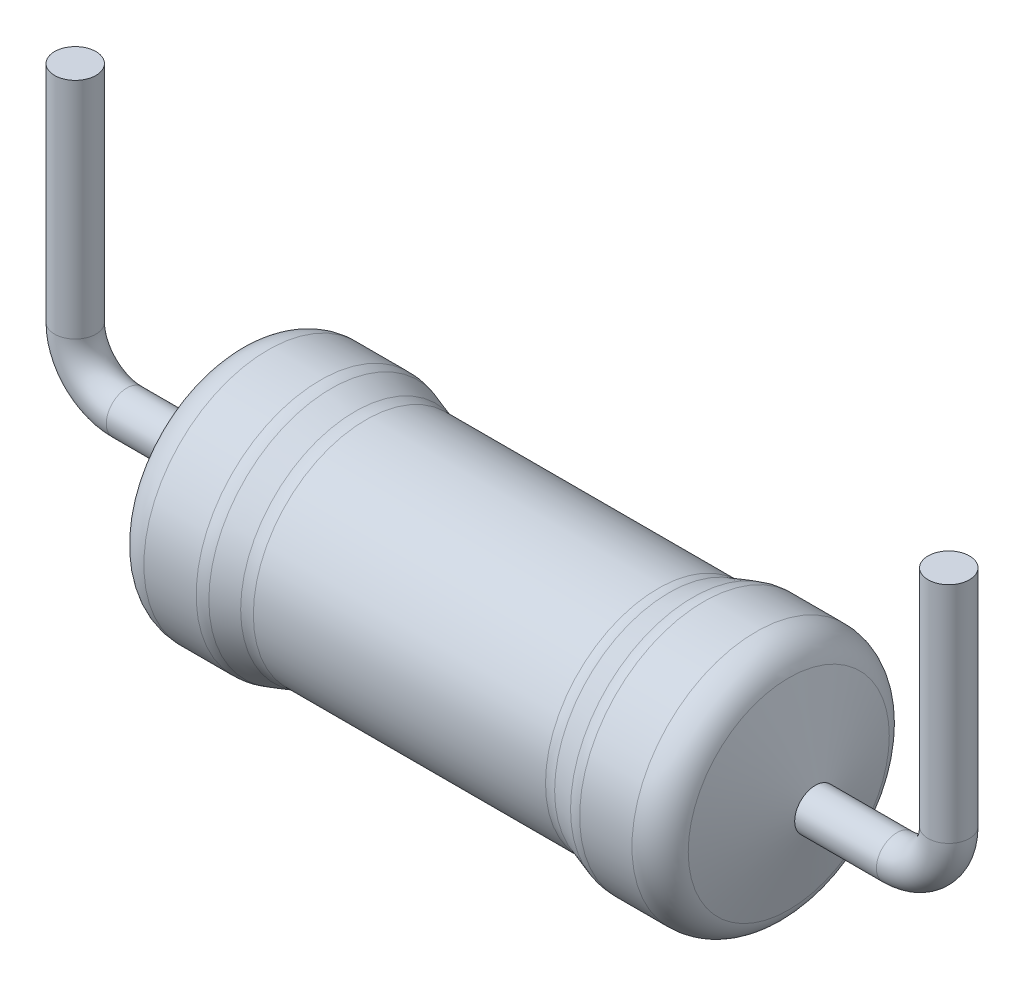
ISO-10303-21;
HEADER;
FILE_DESCRIPTION(('STEP AP214'),'2;1');
FILE_NAME('part.step','',(''),(''),'','','');
FILE_SCHEMA(('AUTOMOTIVE_DESIGN { 1 0 10303 214 1 1 1 1 }'));
ENDSEC;
DATA;
#1=APPLICATION_CONTEXT('core data for automotive mechanical design processes');
#2=APPLICATION_PROTOCOL_DEFINITION('international standard','automotive_design',2000,#1);
#3=PRODUCT_CONTEXT('',#1,'mechanical');
#4=PRODUCT('Part','Part','',(#3));
#5=PRODUCT_RELATED_PRODUCT_CATEGORY('part','',(#4));
#6=PRODUCT_DEFINITION_FORMATION('','',#4);
#7=PRODUCT_DEFINITION_CONTEXT('part definition',#1,'design');
#8=PRODUCT_DEFINITION('design','',#6,#7);
#9=PRODUCT_DEFINITION_SHAPE('','',#8);
#10=(LENGTH_UNIT() NAMED_UNIT(*) SI_UNIT(.MILLI.,.METRE.));
#11=(NAMED_UNIT(*) PLANE_ANGLE_UNIT() SI_UNIT($,.RADIAN.));
#12=(NAMED_UNIT(*) SI_UNIT($,.STERADIAN.) SOLID_ANGLE_UNIT());
#13=UNCERTAINTY_MEASURE_WITH_UNIT(LENGTH_MEASURE(1.E-05),#10,'distance_accuracy_value','');
#14=(GEOMETRIC_REPRESENTATION_CONTEXT(3) GLOBAL_UNCERTAINTY_ASSIGNED_CONTEXT((#13)) GLOBAL_UNIT_ASSIGNED_CONTEXT((#10,
#11,#12)) REPRESENTATION_CONTEXT('',''));
#15=CARTESIAN_POINT('',(0.,0.,0.));
#16=DIRECTION('',(0.,0.,1.));
#17=DIRECTION('',(1.,0.,0.));
#18=AXIS2_PLACEMENT_3D('',#15,#16,#17);
#19=CARTESIAN_POINT('',(4.4,0.,0.));
#20=DIRECTION('',(-1.,0.,0.));
#21=DIRECTION('',(0.,0.,1.));
#22=AXIS2_PLACEMENT_3D('',#19,#20,#21);
#23=CONICAL_SURFACE('',#22,0.3,1.24904577239825);
#24=CARTESIAN_POINT('',(4.01396203899719,0.,0.));
#25=DIRECTION('',(1.,0.,0.));
#26=DIRECTION('',(0.,0.,-1.));
#27=AXIS2_PLACEMENT_3D('',#24,#25,#26);
#28=CIRCLE('',#27,1.45811388300842);
#29=CARTESIAN_POINT('',(4.01396203899719,0.,1.45811388300842));
#30=VERTEX_POINT('',#29);
#31=EDGE_CURVE('E11',#30,#30,#28,.T.);
#32=CARTESIAN_POINT('',(4.4,0.,0.));
#33=DIRECTION('',(-1.,0.,0.));
#34=DIRECTION('',(0.,0.,1.));
#35=AXIS2_PLACEMENT_3D('',#32,#33,#34);
#36=CIRCLE('',#35,0.3);
#37=CARTESIAN_POINT('',(4.4,0.,0.299999999999999));
#38=VERTEX_POINT('',#37);
#39=EDGE_CURVE('E61',#38,#38,#36,.T.);
#40=CARTESIAN_POINT('',(4.01396203899719,0.,1.45811388300842));
#41=CARTESIAN_POINT('',(4.01798326775764,0.,1.44605019672708));
#42=CARTESIAN_POINT('',(4.02200449651808,0.,1.43398651044574));
#43=CARTESIAN_POINT('',(4.03004695403898,0.,1.40985913788307));
#44=CARTESIAN_POINT('',(4.03406818279942,0.,1.39779545160173));
#45=CARTESIAN_POINT('',(4.04211064032032,0.,1.37366807903906));
#46=CARTESIAN_POINT('',(4.04613186908076,0.,1.36160439275772));
#47=CARTESIAN_POINT('',(4.05417432660165,0.,1.33747702019504));
#48=CARTESIAN_POINT('',(4.0581955553621,0.,1.32541333391371));
#49=CARTESIAN_POINT('',(4.06623801288299,0.,1.30128596135103));
#50=CARTESIAN_POINT('',(4.07025924164344,0.,1.28922227506969));
#51=CARTESIAN_POINT('',(4.07830169916433,0.,1.26509490250702));
#52=CARTESIAN_POINT('',(4.08232292792477,0.,1.25303121622568));
#53=CARTESIAN_POINT('',(4.09036538544566,0.,1.228903843663));
#54=CARTESIAN_POINT('',(4.09438661420611,0.,1.21684015738167));
#55=CARTESIAN_POINT('',(4.102429071727,0.,1.19271278481899));
#56=CARTESIAN_POINT('',(4.10645030048745,0.,1.18064909853765));
#57=CARTESIAN_POINT('',(4.11449275800834,0.,1.15652172597498));
#58=CARTESIAN_POINT('',(4.11851398676879,0.,1.14445803969364));
#59=CARTESIAN_POINT('',(4.12655644428968,0.,1.12033066713096));
#60=CARTESIAN_POINT('',(4.13057767305012,0.,1.10826698084963));
#61=CARTESIAN_POINT('',(4.13862013057102,0.,1.08413960828695));
#62=CARTESIAN_POINT('',(4.14264135933146,0.,1.07207592200561));
#63=CARTESIAN_POINT('',(4.15068381685235,0.,1.04794854944294));
#64=CARTESIAN_POINT('',(4.1547050456128,0.,1.0358848631616));
#65=CARTESIAN_POINT('',(4.16274750313369,0.,1.01175749059892));
#66=CARTESIAN_POINT('',(4.16676873189414,0.,0.999693804317587));
#67=CARTESIAN_POINT('',(4.17481118941503,0.,0.975566431754911));
#68=CARTESIAN_POINT('',(4.17883241817547,0.,0.963502745473573));
#69=CARTESIAN_POINT('',(4.18687487569637,0.,0.939375372910898));
#70=CARTESIAN_POINT('',(4.19089610445681,0.,0.92731168662956));
#71=CARTESIAN_POINT('',(4.19893856197771,0.,0.903184314066885));
#72=CARTESIAN_POINT('',(4.20295979073815,0.,0.891120627785547));
#73=CARTESIAN_POINT('',(4.21100224825904,0.,0.866993255222872));
#74=CARTESIAN_POINT('',(4.21502347701949,0.,0.854929568941534));
#75=CARTESIAN_POINT('',(4.22306593454038,0.,0.830802196378858));
#76=CARTESIAN_POINT('',(4.22708716330083,0.,0.818738510097521));
#77=CARTESIAN_POINT('',(4.23512962082172,0.,0.794611137534845));
#78=CARTESIAN_POINT('',(4.23915084958217,0.,0.782547451253508));
#79=CARTESIAN_POINT('',(4.24719330710306,0.,0.758420078690832));
#80=CARTESIAN_POINT('',(4.2512145358635,0.,0.746356392409494));
#81=CARTESIAN_POINT('',(4.25925699338439,0.,0.722229019846819));
#82=CARTESIAN_POINT('',(4.26327822214484,0.,0.710165333565481));
#83=CARTESIAN_POINT('',(4.27132067966573,0.,0.686037961002806));
#84=CARTESIAN_POINT('',(4.27534190842618,0.,0.673974274721468));
#85=CARTESIAN_POINT('',(4.28338436594707,0.,0.649846902158793));
#86=CARTESIAN_POINT('',(4.28740559470751,0.,0.637783215877455));
#87=CARTESIAN_POINT('',(4.29544805222841,0.,0.61365584331478));
#88=CARTESIAN_POINT('',(4.29946928098885,0.,0.601592157033442));
#89=CARTESIAN_POINT('',(4.30751173850974,0.,0.577464784470766));
#90=CARTESIAN_POINT('',(4.31153296727019,0.,0.565401098189429));
#91=CARTESIAN_POINT('',(4.31957542479108,0.,0.541273725626753));
#92=CARTESIAN_POINT('',(4.32359665355153,0.,0.529210039345415));
#93=CARTESIAN_POINT('',(4.33163911107242,0.,0.50508266678274));
#94=CARTESIAN_POINT('',(4.33566033983286,0.,0.493018980501402));
#95=CARTESIAN_POINT('',(4.34370279735376,0.,0.468891607938727));
#96=CARTESIAN_POINT('',(4.3477240261142,0.,0.456827921657389));
#97=CARTESIAN_POINT('',(4.3557664836351,0.,0.432700549094714));
#98=CARTESIAN_POINT('',(4.35978771239554,0.,0.420636862813376));
#99=CARTESIAN_POINT('',(4.36783016991643,0.,0.3965094902507));
#100=CARTESIAN_POINT('',(4.37185139867688,0.,0.384445803969363));
#101=CARTESIAN_POINT('',(4.37989385619777,0.,0.360318431406687));
#102=CARTESIAN_POINT('',(4.38391508495822,0.,0.34825474512535));
#103=CARTESIAN_POINT('',(4.39195754247911,0.,0.324127372562674));
#104=CARTESIAN_POINT('',(4.39597877123955,0.,0.312063686281337));
#105=CARTESIAN_POINT('',(4.4,0.,0.299999999999999));
#106=B_SPLINE_CURVE_WITH_KNOTS('',3,(#40,#41,#42,#43,#44,#45,#46,#47,#48,#49,#50,#51,#52,#53,
#54,#55,#56,#57,#58,#59,#60,#61,#62,#63,#64,#65,#66,#67,#68,#69,#70,#71,#72,#73,#74,#75,#76,#77,
#78,#79,#80,#81,#82,#83,#84,#85,#86,#87,#88,#89,#90,#91,#92,#93,#94,#95,#96,#97,#98,#99,#100,
#101,#102,#103,#104,#105),.UNSPECIFIED.,.F.,.F.,(4,2,2,2,2,2,2,2,2,2,2,2,2,2,2,2,2,2,2,2,2,2,2,
2,2,2,2,2,2,2,2,2,4),(0.,0.0381487256267539,0.0762974512535079,0.114446176880262,
0.152594902507016,0.19074362813377,0.228892353760524,0.267041079387278,0.305189805014032,
0.343338530640786,0.38148725626754,0.419635981894294,0.457784707521048,0.495933433147802,
0.534082158774556,0.57223088440131,0.610379610028064,0.648528335654818,0.686677061281572,
0.724825786908327,0.76297451253508,0.801123238161835,0.839271963788589,0.877420689415343,
0.915569415042097,0.953718140668851,0.991866866295605,1.03001559192236,1.06816431754911,
1.10631304317587,1.14446176880262,1.18261049442937,1.22075922005613),.UNSPECIFIED.);
#107=EDGE_CURVE('BSEAM39',#30,#38,#106,.T.);
#108=ORIENTED_EDGE('',*,*,#31,.T.);
#109=ORIENTED_EDGE('',*,*,#39,.T.);
#110=ORIENTED_EDGE('',*,*,#107,.T.);
#111=ORIENTED_EDGE('',*,*,#107,.F.);
#112=EDGE_LOOP('',(#108,#110,#109,#111));
#113=FACE_BOUND('',#112,.T.);
#114=ADVANCED_FACE('F39',(#113),#23,.T.);
#115=CARTESIAN_POINT('',(0.,0.,0.));
#116=DIRECTION('',(-1.,0.,0.));
#117=DIRECTION('',(0.,0.,1.));
#118=AXIS2_PLACEMENT_3D('',#115,#116,#117);
#119=CYLINDRICAL_SURFACE('',#118,1.8);
#120=CARTESIAN_POINT('',(2.78113883008419,0.,0.));
#121=DIRECTION('',(1.,0.,0.));
#122=DIRECTION('',(0.,0.,-1.));
#123=AXIS2_PLACEMENT_3D('',#120,#121,#122);
#124=CIRCLE('',#123,1.8);
#125=CARTESIAN_POINT('',(2.78113883008419,0.,-1.8));
#126=VERTEX_POINT('',#125);
#127=EDGE_CURVE('E48',#126,#126,#124,.T.);
#128=ORIENTED_EDGE('',*,*,#127,.T.);
#129=EDGE_LOOP('',(#128));
#130=FACE_BOUND('',#129,.T.);
#131=CARTESIAN_POINT('',(3.53962038997194,0.,0.));
#132=DIRECTION('',(1.,0.,0.));
#133=DIRECTION('',(0.,0.,-1.));
#134=AXIS2_PLACEMENT_3D('',#131,#132,#133);
#135=CIRCLE('',#134,1.8);
#136=CARTESIAN_POINT('',(3.53962038997194,0.,-1.8));
#137=VERTEX_POINT('',#136);
#138=EDGE_CURVE('E113',#137,#137,#135,.F.);
#139=ORIENTED_EDGE('',*,*,#138,.T.);
#140=EDGE_LOOP('',(#139));
#141=FACE_BOUND('',#140,.T.);
#142=ADVANCED_FACE('F120',(#130,#141),#119,.T.);
#143=CARTESIAN_POINT('',(2.7,0.,0.));
#144=DIRECTION('',(1.,0.,0.));
#145=DIRECTION('',(0.,0.,-1.));
#146=AXIS2_PLACEMENT_3D('',#143,#144,#145);
#147=CONICAL_SURFACE('',#146,1.8,0.321750554396642);
#148=CARTESIAN_POINT('',(2.27697505292423,0.,0.));
#149=DIRECTION('',(1.,0.,0.));
#150=DIRECTION('',(0.,0.,-1.));
#151=AXIS2_PLACEMENT_3D('',#148,#149,#150);
#152=CIRCLE('',#151,1.65899168430808);
#153=CARTESIAN_POINT('',(2.27697505292423,0.,-1.65899168430808));
#154=VERTEX_POINT('',#153);
#155=EDGE_CURVE('E109',#154,#154,#152,.T.);
#156=ORIENTED_EDGE('',*,*,#155,.T.);
#157=EDGE_LOOP('',(#156));
#158=FACE_BOUND('',#157,.T.);
#159=CARTESIAN_POINT('',(2.62302494707577,0.,0.));
#160=DIRECTION('',(-1.,0.,0.));
#161=DIRECTION('',(0.,0.,1.));
#162=AXIS2_PLACEMENT_3D('',#159,#160,#161);
#163=CIRCLE('',#162,1.77434164902526);
#164=CARTESIAN_POINT('',(2.62302494707577,0.,1.77434164902526));
#165=VERTEX_POINT('',#164);
#166=EDGE_CURVE('E105',#165,#165,#163,.T.);
#167=ORIENTED_EDGE('',*,*,#166,.T.);
#168=EDGE_LOOP('',(#167));
#169=FACE_BOUND('',#168,.T.);
#170=ADVANCED_FACE('F129',(#158,#169),#147,.T.);
#171=CARTESIAN_POINT('',(0.,0.,0.));
#172=DIRECTION('',(-1.,0.,0.));
#173=DIRECTION('',(0.,0.,1.));
#174=AXIS2_PLACEMENT_3D('',#171,#172,#173);
#175=CYLINDRICAL_SURFACE('',#174,1.63333333333333);
#176=CARTESIAN_POINT('',(-2.11886116991581,0.,0.));
#177=DIRECTION('',(-1.,0.,0.));
#178=DIRECTION('',(0.,0.,1.));
#179=AXIS2_PLACEMENT_3D('',#176,#177,#178);
#180=CIRCLE('',#179,1.63333333333333);
#181=CARTESIAN_POINT('',(-2.11886116991581,0.,1.63333333333333));
#182=VERTEX_POINT('',#181);
#183=EDGE_CURVE('E101',#182,#182,#180,.F.);
#184=ORIENTED_EDGE('',*,*,#183,.T.);
#185=EDGE_LOOP('',(#184));
#186=FACE_BOUND('',#185,.T.);
#187=CARTESIAN_POINT('',(2.11886116991581,0.,0.));
#188=DIRECTION('',(-1.,0.,0.));
#189=DIRECTION('',(0.,0.,1.));
#190=AXIS2_PLACEMENT_3D('',#187,#188,#189);
#191=CIRCLE('',#190,1.63333333333333);
#192=CARTESIAN_POINT('',(2.11886116991581,0.,1.63333333333333));
#193=VERTEX_POINT('',#192);
#194=EDGE_CURVE('E97',#193,#193,#191,.T.);
#195=ORIENTED_EDGE('',*,*,#194,.T.);
#196=EDGE_LOOP('',(#195));
#197=FACE_BOUND('',#196,.T.);
#198=ADVANCED_FACE('F131',(#186,#197),#175,.T.);
#199=CARTESIAN_POINT('',(-2.2,0.,0.));
#200=DIRECTION('',(-1.,0.,0.));
#201=DIRECTION('',(0.,0.,1.));
#202=AXIS2_PLACEMENT_3D('',#199,#200,#201);
#203=CONICAL_SURFACE('',#202,1.63333333333333,0.321750554396643);
#204=CARTESIAN_POINT('',(-2.62302494707577,0.,0.));
#205=DIRECTION('',(1.,0.,0.));
#206=DIRECTION('',(0.,0.,-1.));
#207=AXIS2_PLACEMENT_3D('',#204,#205,#206);
#208=CIRCLE('',#207,1.77434164902526);
#209=CARTESIAN_POINT('',(-2.62302494707577,0.,-1.77434164902526));
#210=VERTEX_POINT('',#209);
#211=EDGE_CURVE('E93',#210,#210,#208,.T.);
#212=ORIENTED_EDGE('',*,*,#211,.T.);
#213=EDGE_LOOP('',(#212));
#214=FACE_BOUND('',#213,.T.);
#215=CARTESIAN_POINT('',(-2.27697505292423,0.,0.));
#216=DIRECTION('',(-1.,0.,0.));
#217=DIRECTION('',(0.,0.,1.));
#218=AXIS2_PLACEMENT_3D('',#215,#216,#217);
#219=CIRCLE('',#218,1.65899168430808);
#220=CARTESIAN_POINT('',(-2.27697505292423,0.,1.65899168430808));
#221=VERTEX_POINT('',#220);
#222=EDGE_CURVE('E89',#221,#221,#219,.T.);
#223=ORIENTED_EDGE('',*,*,#222,.T.);
#224=EDGE_LOOP('',(#223));
#225=FACE_BOUND('',#224,.T.);
#226=ADVANCED_FACE('F138',(#214,#225),#203,.T.);
#227=CARTESIAN_POINT('',(0.,0.,0.));
#228=DIRECTION('',(-1.,0.,0.));
#229=DIRECTION('',(0.,0.,1.));
#230=AXIS2_PLACEMENT_3D('',#227,#228,#229);
#231=CYLINDRICAL_SURFACE('',#230,1.8);
#232=CARTESIAN_POINT('',(-3.53962038997194,0.,0.));
#233=DIRECTION('',(1.,0.,0.));
#234=DIRECTION('',(0.,0.,-1.));
#235=AXIS2_PLACEMENT_3D('',#232,#233,#234);
#236=CIRCLE('',#235,1.8);
#237=CARTESIAN_POINT('',(-3.53962038997194,0.,-1.8));
#238=VERTEX_POINT('',#237);
#239=EDGE_CURVE('E85',#238,#238,#236,.T.);
#240=ORIENTED_EDGE('',*,*,#239,.T.);
#241=EDGE_LOOP('',(#240));
#242=FACE_BOUND('',#241,.T.);
#243=CARTESIAN_POINT('',(-2.78113883008419,0.,0.));
#244=DIRECTION('',(1.,0.,0.));
#245=DIRECTION('',(0.,0.,-1.));
#246=AXIS2_PLACEMENT_3D('',#243,#244,#245);
#247=CIRCLE('',#246,1.8);
#248=CARTESIAN_POINT('',(-2.78113883008419,0.,-1.8));
#249=VERTEX_POINT('',#248);
#250=EDGE_CURVE('E81',#249,#249,#247,.F.);
#251=ORIENTED_EDGE('',*,*,#250,.T.);
#252=EDGE_LOOP('',(#251));
#253=FACE_BOUND('',#252,.T.);
#254=ADVANCED_FACE('F285',(#242,#253),#231,.T.);
#255=CARTESIAN_POINT('',(-3.9,0.,0.));
#256=DIRECTION('',(1.,0.,0.));
#257=DIRECTION('',(0.,0.,-1.));
#258=AXIS2_PLACEMENT_3D('',#255,#256,#257);
#259=CONICAL_SURFACE('',#258,1.8,1.24904577239825);
#260=CARTESIAN_POINT('',(-4.0139620389972,0.,0.));
#261=DIRECTION('',(-1.,0.,0.));
#262=DIRECTION('',(0.,0.,1.));
#263=AXIS2_PLACEMENT_3D('',#260,#261,#262);
#264=CIRCLE('',#263,1.45811388300842);
#265=CARTESIAN_POINT('',(-4.01396203899719,0.,-1.45811388300842));
#266=VERTEX_POINT('',#265);
#267=EDGE_CURVE('E77',#266,#266,#264,.T.);
#268=CARTESIAN_POINT('',(-4.4,0.,0.));
#269=DIRECTION('',(-1.,0.,0.));
#270=DIRECTION('',(0.,0.,1.));
#271=AXIS2_PLACEMENT_3D('',#268,#269,#270);
#272=CIRCLE('',#271,0.3);
#273=CARTESIAN_POINT('',(-4.4,0.,-0.300000000000001));
#274=VERTEX_POINT('',#273);
#275=EDGE_CURVE('E67',#274,#274,#272,.T.);
#276=CARTESIAN_POINT('',(-4.01396203899719,0.,-1.45811388300842));
#277=CARTESIAN_POINT('',(-4.01798326775764,0.,-1.44605019672708));
#278=CARTESIAN_POINT('',(-4.02200449651809,0.,-1.43398651044574));
#279=CARTESIAN_POINT('',(-4.03004695403898,0.,-1.40985913788307));
#280=CARTESIAN_POINT('',(-4.03406818279942,0.,-1.39779545160173));
#281=CARTESIAN_POINT('',(-4.04211064032032,0.,-1.37366807903906));
#282=CARTESIAN_POINT('',(-4.04613186908076,0.,-1.36160439275772));
#283=CARTESIAN_POINT('',(-4.05417432660165,0.,-1.33747702019504));
#284=CARTESIAN_POINT('',(-4.0581955553621,0.,-1.3254133339137));
#285=CARTESIAN_POINT('',(-4.06623801288299,0.,-1.30128596135103));
#286=CARTESIAN_POINT('',(-4.07025924164344,0.,-1.28922227506969));
#287=CARTESIAN_POINT('',(-4.07830169916433,0.,-1.26509490250702));
#288=CARTESIAN_POINT('',(-4.08232292792477,0.,-1.25303121622568));
#289=CARTESIAN_POINT('',(-4.09036538544566,0.,-1.228903843663));
#290=CARTESIAN_POINT('',(-4.09438661420611,0.,-1.21684015738167));
#291=CARTESIAN_POINT('',(-4.102429071727,0.,-1.19271278481899));
#292=CARTESIAN_POINT('',(-4.10645030048745,0.,-1.18064909853765));
#293=CARTESIAN_POINT('',(-4.11449275800834,0.,-1.15652172597498));
#294=CARTESIAN_POINT('',(-4.11851398676879,0.,-1.14445803969364));
#295=CARTESIAN_POINT('',(-4.12655644428968,0.,-1.12033066713096));
#296=CARTESIAN_POINT('',(-4.13057767305013,0.,-1.10826698084963));
#297=CARTESIAN_POINT('',(-4.13862013057102,0.,-1.08413960828695));
#298=CARTESIAN_POINT('',(-4.14264135933146,0.,-1.07207592200561));
#299=CARTESIAN_POINT('',(-4.15068381685235,0.,-1.04794854944294));
#300=CARTESIAN_POINT('',(-4.1547050456128,0.,-1.0358848631616));
#301=CARTESIAN_POINT('',(-4.16274750313369,0.,-1.01175749059892));
#302=CARTESIAN_POINT('',(-4.16676873189414,0.,-0.999693804317587));
#303=CARTESIAN_POINT('',(-4.17481118941503,0.,-0.975566431754912));
#304=CARTESIAN_POINT('',(-4.17883241817548,0.,-0.963502745473574));
#305=CARTESIAN_POINT('',(-4.18687487569637,0.,-0.939375372910899));
#306=CARTESIAN_POINT('',(-4.19089610445681,0.,-0.927311686629561));
#307=CARTESIAN_POINT('',(-4.19893856197771,0.,-0.903184314066886));
#308=CARTESIAN_POINT('',(-4.20295979073815,0.,-0.891120627785548));
#309=CARTESIAN_POINT('',(-4.21100224825904,0.,-0.866993255222873));
#310=CARTESIAN_POINT('',(-4.21502347701949,0.,-0.854929568941535));
#311=CARTESIAN_POINT('',(-4.22306593454038,0.,-0.83080219637886));
#312=CARTESIAN_POINT('',(-4.22708716330083,0.,-0.818738510097522));
#313=CARTESIAN_POINT('',(-4.23512962082172,0.,-0.794611137534846));
#314=CARTESIAN_POINT('',(-4.23915084958216,0.,-0.782547451253509));
#315=CARTESIAN_POINT('',(-4.24719330710306,0.,-0.758420078690833));
#316=CARTESIAN_POINT('',(-4.2512145358635,0.,-0.746356392409496));
#317=CARTESIAN_POINT('',(-4.25925699338439,0.,-0.72222901984682));
#318=CARTESIAN_POINT('',(-4.26327822214484,0.,-0.710165333565483));
#319=CARTESIAN_POINT('',(-4.27132067966573,0.,-0.686037961002807));
#320=CARTESIAN_POINT('',(-4.27534190842618,0.,-0.67397427472147));
#321=CARTESIAN_POINT('',(-4.28338436594707,0.,-0.649846902158794));
#322=CARTESIAN_POINT('',(-4.28740559470751,0.,-0.637783215877457));
#323=CARTESIAN_POINT('',(-4.29544805222841,0.,-0.613655843314781));
#324=CARTESIAN_POINT('',(-4.29946928098885,0.,-0.601592157033444));
#325=CARTESIAN_POINT('',(-4.30751173850974,0.,-0.577464784470768));
#326=CARTESIAN_POINT('',(-4.31153296727019,0.,-0.565401098189431));
#327=CARTESIAN_POINT('',(-4.31957542479108,0.,-0.541273725626755));
#328=CARTESIAN_POINT('',(-4.32359665355153,0.,-0.529210039345417));
#329=CARTESIAN_POINT('',(-4.33163911107242,0.,-0.505082666782742));
#330=CARTESIAN_POINT('',(-4.33566033983287,0.,-0.493018980501404));
#331=CARTESIAN_POINT('',(-4.34370279735376,0.,-0.468891607938729));
#332=CARTESIAN_POINT('',(-4.3477240261142,0.,-0.456827921657391));
#333=CARTESIAN_POINT('',(-4.3557664836351,0.,-0.432700549094716));
#334=CARTESIAN_POINT('',(-4.35978771239554,0.,-0.420636862813378));
#335=CARTESIAN_POINT('',(-4.36783016991643,0.,-0.396509490250703));
#336=CARTESIAN_POINT('',(-4.37185139867688,0.,-0.384445803969365));
#337=CARTESIAN_POINT('',(-4.37989385619777,0.,-0.36031843140669));
#338=CARTESIAN_POINT('',(-4.38391508495822,0.,-0.348254745125352));
#339=CARTESIAN_POINT('',(-4.39195754247911,0.,-0.324127372562677));
#340=CARTESIAN_POINT('',(-4.39597877123955,0.,-0.312063686281339));
#341=CARTESIAN_POINT('',(-4.4,0.,-0.300000000000001));
#342=B_SPLINE_CURVE_WITH_KNOTS('',3,(#276,#277,#278,#279,#280,#281,#282,#283,#284,#285,#286,
#287,#288,#289,#290,#291,#292,#293,#294,#295,#296,#297,#298,#299,#300,#301,#302,#303,#304,#305,
#306,#307,#308,#309,#310,#311,#312,#313,#314,#315,#316,#317,#318,#319,#320,#321,#322,#323,#324,
#325,#326,#327,#328,#329,#330,#331,#332,#333,#334,#335,#336,#337,#338,#339,#340,#341),
.UNSPECIFIED.,.F.,.F.,(4,2,2,2,2,2,2,2,2,2,2,2,2,2,2,2,2,2,2,2,2,2,2,2,2,2,2,2,2,2,2,2,4),(0.,
0.038148725626754,0.076297451253508,0.114446176880262,0.152594902507016,0.19074362813377,
0.228892353760523,0.267041079387277,0.305189805014031,0.343338530640785,0.381487256267539,
0.419635981894293,0.457784707521047,0.495933433147801,0.534082158774555,0.572230884401309,
0.610379610028063,0.648528335654816,0.686677061281571,0.724825786908325,0.762974512535079,
0.801123238161833,0.839271963788586,0.87742068941534,0.915569415042094,0.953718140668848,
0.991866866295602,1.03001559192236,1.06816431754911,1.10631304317586,1.14446176880262,
1.18261049442937,1.22075922005613),.UNSPECIFIED.);
#343=EDGE_CURVE('BSEAM153',#266,#274,#342,.T.);
#344=ORIENTED_EDGE('',*,*,#267,.T.);
#345=ORIENTED_EDGE('',*,*,#275,.F.);
#346=ORIENTED_EDGE('',*,*,#343,.T.);
#347=ORIENTED_EDGE('',*,*,#343,.F.);
#348=EDGE_LOOP('',(#344,#346,#345,#347));
#349=FACE_BOUND('',#348,.T.);
#350=ADVANCED_FACE('F153',(#349),#259,.T.);
#351=CARTESIAN_POINT('',(-3.53962038997194,0.,0.));
#352=DIRECTION('',(1.,0.,0.));
#353=DIRECTION('',(0.,0.,-1.));
#354=AXIS2_PLACEMENT_3D('',#351,#352,#353);
#355=TOROIDAL_SURFACE('',#354,1.3,0.5);
#356=ORIENTED_EDGE('',*,*,#239,.F.);
#357=EDGE_LOOP('',(#356));
#358=FACE_BOUND('',#357,.T.);
#359=ORIENTED_EDGE('',*,*,#267,.F.);
#360=EDGE_LOOP('',(#359));
#361=FACE_BOUND('',#360,.T.);
#362=ADVANCED_FACE('F149',(#358,#361),#355,.T.);
#363=CARTESIAN_POINT('',(-2.78113883008419,0.,0.));
#364=DIRECTION('',(1.,0.,0.));
#365=DIRECTION('',(0.,0.,-1.));
#366=AXIS2_PLACEMENT_3D('',#363,#364,#365);
#367=TOROIDAL_SURFACE('',#366,1.3,0.5);
#368=ORIENTED_EDGE('',*,*,#211,.F.);
#369=EDGE_LOOP('',(#368));
#370=FACE_BOUND('',#369,.T.);
#371=ORIENTED_EDGE('',*,*,#250,.F.);
#372=EDGE_LOOP('',(#371));
#373=FACE_BOUND('',#372,.T.);
#374=ADVANCED_FACE('F152',(#370,#373),#367,.T.);
#375=CARTESIAN_POINT('',(-2.11886116991581,0.,0.));
#376=DIRECTION('',(-1.,0.,0.));
#377=DIRECTION('',(0.,0.,1.));
#378=AXIS2_PLACEMENT_3D('',#375,#376,#377);
#379=TOROIDAL_SURFACE('',#378,2.13333333333333,0.5);
#380=ORIENTED_EDGE('',*,*,#183,.F.);
#381=EDGE_LOOP('',(#380));
#382=FACE_BOUND('',#381,.T.);
#383=ORIENTED_EDGE('',*,*,#222,.F.);
#384=EDGE_LOOP('',(#383));
#385=FACE_BOUND('',#384,.T.);
#386=ADVANCED_FACE('F157',(#382,#385),#379,.F.);
#387=CARTESIAN_POINT('',(2.11886116991581,0.,0.));
#388=DIRECTION('',(-1.,0.,0.));
#389=DIRECTION('',(0.,0.,1.));
#390=AXIS2_PLACEMENT_3D('',#387,#388,#389);
#391=TOROIDAL_SURFACE('',#390,2.13333333333333,0.5);
#392=ORIENTED_EDGE('',*,*,#155,.F.);
#393=EDGE_LOOP('',(#392));
#394=FACE_BOUND('',#393,.T.);
#395=ORIENTED_EDGE('',*,*,#194,.F.);
#396=EDGE_LOOP('',(#395));
#397=FACE_BOUND('',#396,.T.);
#398=ADVANCED_FACE('F126',(#394,#397),#391,.F.);
#399=CARTESIAN_POINT('',(2.78113883008419,0.,0.));
#400=DIRECTION('',(1.,0.,0.));
#401=DIRECTION('',(0.,0.,-1.));
#402=AXIS2_PLACEMENT_3D('',#399,#400,#401);
#403=TOROIDAL_SURFACE('',#402,1.3,0.5);
#404=ORIENTED_EDGE('',*,*,#127,.F.);
#405=EDGE_LOOP('',(#404));
#406=FACE_BOUND('',#405,.T.);
#407=ORIENTED_EDGE('',*,*,#166,.F.);
#408=EDGE_LOOP('',(#407));
#409=FACE_BOUND('',#408,.T.);
#410=ADVANCED_FACE('F123',(#406,#409),#403,.T.);
#411=CARTESIAN_POINT('',(3.53962038997194,0.,0.));
#412=DIRECTION('',(1.,0.,0.));
#413=DIRECTION('',(0.,0.,-1.));
#414=AXIS2_PLACEMENT_3D('',#411,#412,#413);
#415=TOROIDAL_SURFACE('',#414,1.3,0.5);
#416=ORIENTED_EDGE('',*,*,#31,.F.);
#417=EDGE_LOOP('',(#416));
#418=FACE_BOUND('',#417,.T.);
#419=ORIENTED_EDGE('',*,*,#138,.F.);
#420=EDGE_LOOP('',(#419));
#421=FACE_BOUND('',#420,.T.);
#422=ADVANCED_FACE('F41',(#418,#421),#415,.T.);
#423=CARTESIAN_POINT('',(-6.335,4.,0.));
#424=DIRECTION('',(0.,-1.,0.));
#425=DIRECTION('',(0.,0.,-1.));
#426=AXIS2_PLACEMENT_3D('',#423,#424,#425);
#427=PLANE('',#426);
#428=CARTESIAN_POINT('',(-6.335,4.,0.));
#429=DIRECTION('',(0.,-1.,0.));
#430=DIRECTION('',(0.,0.,-1.));
#431=AXIS2_PLACEMENT_3D('',#428,#429,#430);
#432=CIRCLE('',#431,0.3);
#433=CARTESIAN_POINT('',(-6.335,4.,-0.3));
#434=VERTEX_POINT('',#433);
#435=EDGE_CURVE('E53',#434,#434,#432,.T.);
#436=ORIENTED_EDGE('',*,*,#435,.F.);
#437=EDGE_LOOP('',(#436));
#438=FACE_BOUND('',#437,.T.);
#439=ADVANCED_FACE('F182',(#438),#427,.F.);
#440=CARTESIAN_POINT('',(-6.335,4.,0.));
#441=DIRECTION('',(0.,-1.,0.));
#442=DIRECTION('',(0.,0.,-1.));
#443=AXIS2_PLACEMENT_3D('',#440,#441,#442);
#444=CYLINDRICAL_SURFACE('',#443,0.3);
#445=CARTESIAN_POINT('',(-6.335,0.749999999999999,0.));
#446=DIRECTION('',(0.,-1.,0.));
#447=DIRECTION('',(0.,0.,-1.));
#448=AXIS2_PLACEMENT_3D('',#445,#446,#447);
#449=CIRCLE('',#448,0.3);
#450=CARTESIAN_POINT('',(-6.635,0.749999999999999,0.));
#451=VERTEX_POINT('',#450);
#452=EDGE_CURVE('E351',#451,#451,#449,.T.);
#453=ORIENTED_EDGE('',*,*,#452,.F.);
#454=EDGE_LOOP('',(#453));
#455=FACE_BOUND('',#454,.T.);
#456=ORIENTED_EDGE('',*,*,#435,.T.);
#457=EDGE_LOOP('',(#456));
#458=FACE_BOUND('',#457,.T.);
#459=ADVANCED_FACE('F189',(#455,#458),#444,.T.);
#460=CARTESIAN_POINT('',(-5.585,0.749999999999999,0.));
#461=DIRECTION('',(0.,0.,1.));
#462=DIRECTION('',(1.,0.,0.));
#463=AXIS2_PLACEMENT_3D('',#460,#461,#462);
#464=TOROIDAL_SURFACE('',#463,0.75,0.3);
#465=CARTESIAN_POINT('',(-5.585,0.,0.));
#466=DIRECTION('',(1.,0.,0.));
#467=DIRECTION('',(0.,0.,-1.));
#468=AXIS2_PLACEMENT_3D('',#465,#466,#467);
#469=CIRCLE('',#468,0.3);
#470=CARTESIAN_POINT('',(-5.585,-0.300000000000001,0.));
#471=VERTEX_POINT('',#470);
#472=EDGE_CURVE('E348',#471,#471,#469,.T.);
#473=CARTESIAN_POINT('',(-5.585,0.749999999999999,0.));
#474=DIRECTION('',(0.,0.,1.));
#475=DIRECTION('',(1.,0.,0.));
#476=AXIS2_PLACEMENT_3D('',#473,#474,#475);
#477=CIRCLE('',#476,1.05);
#478=EDGE_CURVE('',#451,#471,#477,.T.);
#479=ORIENTED_EDGE('',*,*,#452,.T.);
#480=ORIENTED_EDGE('',*,*,#472,.F.);
#481=ORIENTED_EDGE('',*,*,#478,.T.);
#482=ORIENTED_EDGE('',*,*,#478,.F.);
#483=EDGE_LOOP('',(#479,#481,#480,#482));
#484=FACE_BOUND('',#483,.T.);
#485=ADVANCED_FACE('F196',(#484),#464,.T.);
#486=CARTESIAN_POINT('',(-5.585,0.,0.));
#487=DIRECTION('',(1.,0.,0.));
#488=DIRECTION('',(0.,1.,0.));
#489=AXIS2_PLACEMENT_3D('',#486,#487,#488);
#490=CYLINDRICAL_SURFACE('',#489,0.3);
#491=ORIENTED_EDGE('',*,*,#472,.T.);
#492=EDGE_LOOP('',(#491));
#493=FACE_BOUND('',#492,.T.);
#494=ORIENTED_EDGE('',*,*,#275,.T.);
#495=EDGE_LOOP('',(#494));
#496=FACE_BOUND('',#495,.T.);
#497=ADVANCED_FACE('F204',(#493,#496),#490,.T.);
#498=CARTESIAN_POINT('',(5.585,0.,0.));
#499=DIRECTION('',(1.,0.,0.));
#500=DIRECTION('',(0.,0.,-1.));
#501=AXIS2_PLACEMENT_3D('',#498,#499,#500);
#502=CIRCLE('',#501,0.3);
#503=CARTESIAN_POINT('',(5.585,-0.299999999999999,0.));
#504=VERTEX_POINT('',#503);
#505=EDGE_CURVE('E70',#504,#504,#502,.T.);
#506=ORIENTED_EDGE('',*,*,#505,.F.);
#507=EDGE_LOOP('',(#506));
#508=FACE_BOUND('',#507,.T.);
#509=ORIENTED_EDGE('',*,*,#39,.F.);
#510=EDGE_LOOP('',(#509));
#511=FACE_BOUND('',#510,.T.);
#512=ADVANCED_FACE('F212',(#508,#511),#490,.T.);
#513=CARTESIAN_POINT('',(6.335,4.,0.));
#514=DIRECTION('',(0.,1.,0.));
#515=DIRECTION('',(0.,0.,-1.));
#516=AXIS2_PLACEMENT_3D('',#513,#514,#515);
#517=PLANE('',#516);
#518=CARTESIAN_POINT('',(6.335,4.,0.));
#519=DIRECTION('',(0.,1.,0.));
#520=DIRECTION('',(0.,0.,-1.));
#521=AXIS2_PLACEMENT_3D('',#518,#519,#520);
#522=CIRCLE('',#521,0.3);
#523=CARTESIAN_POINT('',(6.335,4.,-0.3));
#524=VERTEX_POINT('',#523);
#525=EDGE_CURVE('E57',#524,#524,#522,.T.);
#526=ORIENTED_EDGE('',*,*,#525,.T.);
#527=EDGE_LOOP('',(#526));
#528=FACE_BOUND('',#527,.T.);
#529=ADVANCED_FACE('F58',(#528),#517,.T.);
#530=CARTESIAN_POINT('',(5.585,0.75,0.));
#531=DIRECTION('',(0.,0.,1.));
#532=DIRECTION('',(1.,0.,0.));
#533=AXIS2_PLACEMENT_3D('',#530,#531,#532);
#534=TOROIDAL_SURFACE('',#533,0.749999999999999,0.3);
#535=CARTESIAN_POINT('',(6.335,0.75,0.));
#536=DIRECTION('',(0.,1.,0.));
#537=DIRECTION('',(0.,0.,-1.));
#538=AXIS2_PLACEMENT_3D('',#535,#536,#537);
#539=CIRCLE('',#538,0.3);
#540=CARTESIAN_POINT('',(6.635,0.75,0.));
#541=VERTEX_POINT('',#540);
#542=EDGE_CURVE('E62',#541,#541,#539,.T.);
#543=CARTESIAN_POINT('',(5.585,0.75,0.));
#544=DIRECTION('',(0.,0.,1.));
#545=DIRECTION('',(1.,0.,0.));
#546=AXIS2_PLACEMENT_3D('',#543,#544,#545);
#547=CIRCLE('',#546,1.05);
#548=EDGE_CURVE('',#504,#541,#547,.T.);
#549=ORIENTED_EDGE('',*,*,#505,.T.);
#550=ORIENTED_EDGE('',*,*,#542,.F.);
#551=ORIENTED_EDGE('',*,*,#548,.T.);
#552=ORIENTED_EDGE('',*,*,#548,.F.);
#553=EDGE_LOOP('',(#549,#551,#550,#552));
#554=FACE_BOUND('',#553,.T.);
#555=ADVANCED_FACE('F227',(#554),#534,.T.);
#556=CARTESIAN_POINT('',(6.335,0.75,0.));
#557=DIRECTION('',(0.,1.,0.));
#558=DIRECTION('',(-1.,0.,0.));
#559=AXIS2_PLACEMENT_3D('',#556,#557,#558);
#560=CYLINDRICAL_SURFACE('',#559,0.3);
#561=ORIENTED_EDGE('',*,*,#525,.F.);
#562=EDGE_LOOP('',(#561));
#563=FACE_BOUND('',#562,.T.);
#564=ORIENTED_EDGE('',*,*,#542,.T.);
#565=EDGE_LOOP('',(#564));
#566=FACE_BOUND('',#565,.T.);
#567=ADVANCED_FACE('F221',(#563,#566),#560,.T.);
#568=CLOSED_SHELL('',(#114,#142,#170,#198,#226,#254,#350,#362,#374,#386,#398,#410,#422,#439,
#459,#485,#497,#512,#529,#555,#567));
#569=MANIFOLD_SOLID_BREP('B2',#568);
#570=ADVANCED_BREP_SHAPE_REPRESENTATION('',(#18,#569),#14);
#571=SHAPE_DEFINITION_REPRESENTATION(#9,#570);
ENDSEC;
END-ISO-10303-21;
